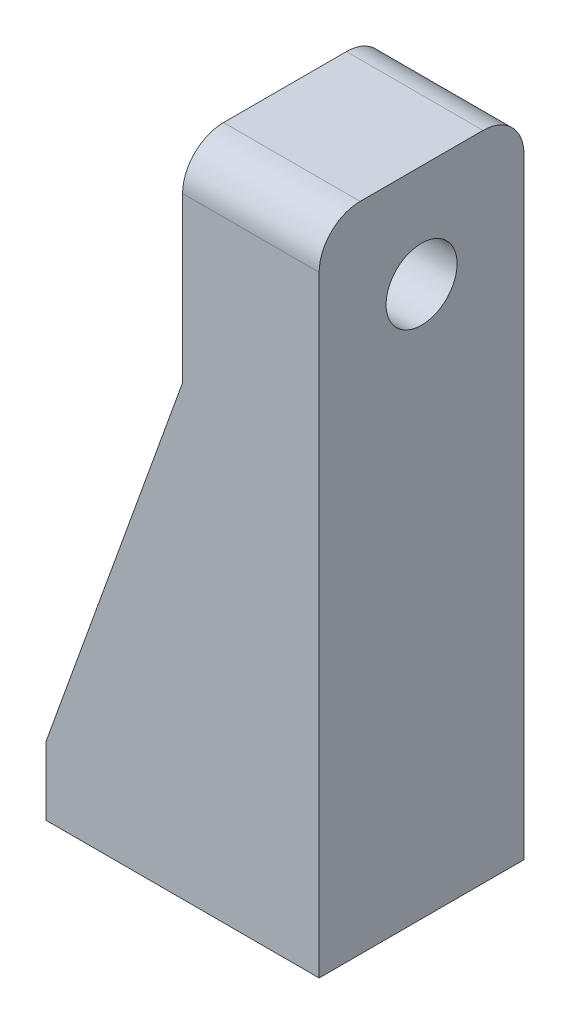
ISO-10303-21;
HEADER;
FILE_DESCRIPTION(('STEP AP214'),'2;1');
FILE_NAME('part.step','',(''),(''),'','','');
FILE_SCHEMA(('AUTOMOTIVE_DESIGN { 1 0 10303 214 1 1 1 1 }'));
ENDSEC;
DATA;
#1=APPLICATION_CONTEXT('core data for automotive mechanical design processes');
#2=APPLICATION_PROTOCOL_DEFINITION('international standard','automotive_design',2000,#1);
#3=PRODUCT_CONTEXT('',#1,'mechanical');
#4=PRODUCT('Part','Part','',(#3));
#5=PRODUCT_RELATED_PRODUCT_CATEGORY('part','',(#4));
#6=PRODUCT_DEFINITION_FORMATION('','',#4);
#7=PRODUCT_DEFINITION_CONTEXT('part definition',#1,'design');
#8=PRODUCT_DEFINITION('design','',#6,#7);
#9=PRODUCT_DEFINITION_SHAPE('','',#8);
#10=(LENGTH_UNIT() NAMED_UNIT(*) SI_UNIT(.MILLI.,.METRE.));
#11=(NAMED_UNIT(*) PLANE_ANGLE_UNIT() SI_UNIT($,.RADIAN.));
#12=(NAMED_UNIT(*) SI_UNIT($,.STERADIAN.) SOLID_ANGLE_UNIT());
#13=UNCERTAINTY_MEASURE_WITH_UNIT(LENGTH_MEASURE(1.E-05),#10,'distance_accuracy_value','');
#14=(GEOMETRIC_REPRESENTATION_CONTEXT(3) GLOBAL_UNCERTAINTY_ASSIGNED_CONTEXT((#13)) GLOBAL_UNIT_ASSIGNED_CONTEXT((#10,
#11,#12)) REPRESENTATION_CONTEXT('',''));
#15=CARTESIAN_POINT('',(0.,0.,0.));
#16=DIRECTION('',(0.,0.,1.));
#17=DIRECTION('',(1.,0.,0.));
#18=AXIS2_PLACEMENT_3D('',#15,#16,#17);
#19=CARTESIAN_POINT('',(-17.7013145607356,6.37885209395877,15.));
#20=DIRECTION('',(0.940779319520141,-0.339019574601853,0.));
#21=DIRECTION('',(0.339019574601853,0.940779319520141,0.));
#22=AXIS2_PLACEMENT_3D('',#19,#20,#21);
#23=PLANE('',#22);
#24=DIRECTION('',(-0.339019574601853,-0.940779319520141,0.));
#25=VECTOR('',#24,1.);
#26=CARTESIAN_POINT('',(-17.7013145607356,6.37885209395877,0.));
#27=LINE('',#26,#25);
#28=CARTESIAN_POINT('',(-10.,27.75,0.));
#29=VERTEX_POINT('',#28);
#30=CARTESIAN_POINT('',(-20.,0.,0.));
#31=VERTEX_POINT('',#30);
#32=EDGE_CURVE('E132',#29,#31,#27,.T.);
#33=ORIENTED_EDGE('',*,*,#32,.T.);
#34=DIRECTION('',(0.,0.,-1.));
#35=VECTOR('',#34,1.);
#36=CARTESIAN_POINT('',(-20.,0.,15.));
#37=LINE('',#36,#35);
#38=CARTESIAN_POINT('',(-20.,0.,15.));
#39=VERTEX_POINT('',#38);
#40=EDGE_CURVE('E111',#39,#31,#37,.T.);
#41=ORIENTED_EDGE('',*,*,#40,.F.);
#42=DIRECTION('',(-0.339019574601853,-0.940779319520141,0.));
#43=VECTOR('',#42,1.);
#44=CARTESIAN_POINT('',(-17.7013145607356,6.37885209395877,15.));
#45=LINE('',#44,#43);
#46=CARTESIAN_POINT('',(-10.,27.75,15.));
#47=VERTEX_POINT('',#46);
#48=EDGE_CURVE('E118',#47,#39,#45,.T.);
#49=ORIENTED_EDGE('',*,*,#48,.F.);
#50=DIRECTION('',(0.,0.,-1.));
#51=VECTOR('',#50,1.);
#52=CARTESIAN_POINT('',(-10.,27.75,15.));
#53=LINE('',#52,#51);
#54=EDGE_CURVE('E171',#47,#29,#53,.T.);
#55=ORIENTED_EDGE('',*,*,#54,.T.);
#56=EDGE_LOOP('',(#33,#41,#49,#55));
#57=FACE_BOUND('',#56,.T.);
#58=ADVANCED_FACE('F40',(#57),#23,.F.);
#59=CARTESIAN_POINT('',(-20.,0.,15.));
#60=DIRECTION('',(1.,0.,0.));
#61=DIRECTION('',(0.,0.,-1.));
#62=AXIS2_PLACEMENT_3D('',#59,#60,#61);
#63=PLANE('',#62);
#64=DIRECTION('',(0.,-1.,0.));
#65=VECTOR('',#64,1.);
#66=CARTESIAN_POINT('',(-20.,0.,0.));
#67=LINE('',#66,#65);
#68=CARTESIAN_POINT('',(-20.,-5.,0.));
#69=VERTEX_POINT('',#68);
#70=EDGE_CURVE('E182',#31,#69,#67,.T.);
#71=ORIENTED_EDGE('',*,*,#70,.T.);
#72=DIRECTION('',(0.,0.,-1.));
#73=VECTOR('',#72,1.);
#74=CARTESIAN_POINT('',(-20.,-5.,15.));
#75=LINE('',#74,#73);
#76=CARTESIAN_POINT('',(-20.,-5.,15.));
#77=VERTEX_POINT('',#76);
#78=EDGE_CURVE('E114',#77,#69,#75,.T.);
#79=ORIENTED_EDGE('',*,*,#78,.F.);
#80=DIRECTION('',(0.,-1.,0.));
#81=VECTOR('',#80,1.);
#82=CARTESIAN_POINT('',(-20.,0.,15.));
#83=LINE('',#82,#81);
#84=EDGE_CURVE('E107',#39,#77,#83,.T.);
#85=ORIENTED_EDGE('',*,*,#84,.F.);
#86=ORIENTED_EDGE('',*,*,#40,.T.);
#87=EDGE_LOOP('',(#71,#79,#85,#86));
#88=FACE_BOUND('',#87,.T.);
#89=ADVANCED_FACE('F109',(#88),#63,.F.);
#90=CARTESIAN_POINT('',(0.,-5.,15.));
#91=DIRECTION('',(0.,1.,0.));
#92=DIRECTION('',(0.,0.,1.));
#93=AXIS2_PLACEMENT_3D('',#90,#91,#92);
#94=PLANE('',#93);
#95=DIRECTION('',(1.,0.,0.));
#96=VECTOR('',#95,1.);
#97=CARTESIAN_POINT('',(0.,-5.,0.));
#98=LINE('',#97,#96);
#99=CARTESIAN_POINT('',(0.,-5.,0.));
#100=VERTEX_POINT('',#99);
#101=EDGE_CURVE('E180',#69,#100,#98,.T.);
#102=ORIENTED_EDGE('',*,*,#101,.T.);
#103=DIRECTION('',(0.,0.,-1.));
#104=VECTOR('',#103,1.);
#105=CARTESIAN_POINT('',(0.,-5.,15.));
#106=LINE('',#105,#104);
#107=CARTESIAN_POINT('',(0.,-5.,15.));
#108=VERTEX_POINT('',#107);
#109=EDGE_CURVE('E137',#108,#100,#106,.T.);
#110=ORIENTED_EDGE('',*,*,#109,.F.);
#111=DIRECTION('',(1.,0.,0.));
#112=VECTOR('',#111,1.);
#113=CARTESIAN_POINT('',(0.,-5.,15.));
#114=LINE('',#113,#112);
#115=EDGE_CURVE('E117',#77,#108,#114,.T.);
#116=ORIENTED_EDGE('',*,*,#115,.F.);
#117=ORIENTED_EDGE('',*,*,#78,.T.);
#118=EDGE_LOOP('',(#102,#110,#116,#117));
#119=FACE_BOUND('',#118,.T.);
#120=ADVANCED_FACE('F235',(#119),#94,.F.);
#121=CARTESIAN_POINT('',(0.,0.,15.));
#122=DIRECTION('',(-1.,0.,0.));
#123=DIRECTION('',(0.,0.,1.));
#124=AXIS2_PLACEMENT_3D('',#121,#122,#123);
#125=PLANE('',#124);
#126=CARTESIAN_POINT('',(0.,35.25,7.5));
#127=DIRECTION('',(1.,0.,0.));
#128=DIRECTION('',(0.,0.,-1.));
#129=AXIS2_PLACEMENT_3D('',#126,#127,#128);
#130=CIRCLE('',#129,2.6);
#131=CARTESIAN_POINT('',(0.,35.25,4.9));
#132=VERTEX_POINT('',#131);
#133=EDGE_CURVE('E187',#132,#132,#130,.T.);
#134=ORIENTED_EDGE('',*,*,#133,.F.);
#135=EDGE_LOOP('',(#134));
#136=FACE_BOUND('',#135,.T.);
#137=DIRECTION('',(0.,0.,-1.));
#138=VECTOR('',#137,1.);
#139=CARTESIAN_POINT('',(0.,42.75,15.));
#140=LINE('',#139,#138);
#141=CARTESIAN_POINT('',(0.,42.75,12.));
#142=VERTEX_POINT('',#141);
#143=CARTESIAN_POINT('',(0.,42.75,3.));
#144=VERTEX_POINT('',#143);
#145=EDGE_CURVE('E156',#142,#144,#140,.T.);
#146=ORIENTED_EDGE('',*,*,#145,.F.);
#147=CARTESIAN_POINT('',(0.,39.75,12.));
#148=DIRECTION('',(-1.,0.,0.));
#149=DIRECTION('',(0.,0.,1.));
#150=AXIS2_PLACEMENT_3D('',#147,#148,#149);
#151=CIRCLE('',#150,3.);
#152=CARTESIAN_POINT('',(0.,39.75,15.));
#153=VERTEX_POINT('',#152);
#154=EDGE_CURVE('E150',#142,#153,#151,.F.);
#155=ORIENTED_EDGE('',*,*,#154,.T.);
#156=DIRECTION('',(0.,1.,0.));
#157=VECTOR('',#156,1.);
#158=CARTESIAN_POINT('',(0.,0.,15.));
#159=LINE('',#158,#157);
#160=EDGE_CURVE('E155',#108,#153,#159,.T.);
#161=ORIENTED_EDGE('',*,*,#160,.F.);
#162=ORIENTED_EDGE('',*,*,#109,.T.);
#163=DIRECTION('',(0.,1.,0.));
#164=VECTOR('',#163,1.);
#165=CARTESIAN_POINT('',(0.,0.,0.));
#166=LINE('',#165,#164);
#167=CARTESIAN_POINT('',(0.,39.75,0.));
#168=VERTEX_POINT('',#167);
#169=EDGE_CURVE('E176',#100,#168,#166,.T.);
#170=ORIENTED_EDGE('',*,*,#169,.T.);
#171=CARTESIAN_POINT('',(0.,39.75,3.));
#172=DIRECTION('',(-1.,0.,0.));
#173=DIRECTION('',(0.,0.,1.));
#174=AXIS2_PLACEMENT_3D('',#171,#172,#173);
#175=CIRCLE('',#174,3.);
#176=EDGE_CURVE('E61',#168,#144,#175,.F.);
#177=ORIENTED_EDGE('',*,*,#176,.T.);
#178=EDGE_LOOP('',(#146,#155,#161,#162,#170,#177));
#179=FACE_BOUND('',#178,.T.);
#180=ADVANCED_FACE('F153',(#136,#179),#125,.F.);
#181=CARTESIAN_POINT('',(0.,42.75,15.));
#182=DIRECTION('',(0.,-1.,0.));
#183=DIRECTION('',(0.,0.,-1.));
#184=AXIS2_PLACEMENT_3D('',#181,#182,#183);
#185=PLANE('',#184);
#186=DIRECTION('',(0.,0.,-1.));
#187=VECTOR('',#186,1.);
#188=CARTESIAN_POINT('',(-10.,42.75,15.));
#189=LINE('',#188,#187);
#190=CARTESIAN_POINT('',(-10.,42.75,12.));
#191=VERTEX_POINT('',#190);
#192=CARTESIAN_POINT('',(-10.,42.75,3.));
#193=VERTEX_POINT('',#192);
#194=EDGE_CURVE('E167',#191,#193,#189,.T.);
#195=ORIENTED_EDGE('',*,*,#194,.F.);
#196=DIRECTION('',(-1.,0.,0.));
#197=VECTOR('',#196,1.);
#198=CARTESIAN_POINT('',(0.,42.75,12.));
#199=LINE('',#198,#197);
#200=EDGE_CURVE('E147',#191,#142,#199,.F.);
#201=ORIENTED_EDGE('',*,*,#200,.T.);
#202=ORIENTED_EDGE('',*,*,#145,.T.);
#203=DIRECTION('',(-1.,0.,0.));
#204=VECTOR('',#203,1.);
#205=CARTESIAN_POINT('',(0.,42.75,3.));
#206=LINE('',#205,#204);
#207=EDGE_CURVE('E144',#144,#193,#206,.T.);
#208=ORIENTED_EDGE('',*,*,#207,.T.);
#209=EDGE_LOOP('',(#195,#201,#202,#208));
#210=FACE_BOUND('',#209,.T.);
#211=ADVANCED_FACE('F169',(#210),#185,.F.);
#212=CARTESIAN_POINT('',(-9.99999999999999,0.,15.));
#213=DIRECTION('',(1.,0.,0.));
#214=DIRECTION('',(0.,1.,0.));
#215=AXIS2_PLACEMENT_3D('',#212,#213,#214);
#216=PLANE('',#215);
#217=CARTESIAN_POINT('',(-10.,35.25,7.5));
#218=DIRECTION('',(-1.,0.,0.));
#219=DIRECTION('',(0.,-1.,0.));
#220=AXIS2_PLACEMENT_3D('',#217,#218,#219);
#221=CIRCLE('',#220,4.5);
#222=CARTESIAN_POINT('',(-10.,30.75,7.5));
#223=VERTEX_POINT('',#222);
#224=EDGE_CURVE('E193',#223,#223,#221,.T.);
#225=ORIENTED_EDGE('',*,*,#224,.F.);
#226=EDGE_LOOP('',(#225));
#227=FACE_BOUND('',#226,.T.);
#228=DIRECTION('',(0.,-1.,0.));
#229=VECTOR('',#228,1.);
#230=CARTESIAN_POINT('',(-9.99999999999999,0.,15.));
#231=LINE('',#230,#229);
#232=CARTESIAN_POINT('',(-10.,39.75,15.));
#233=VERTEX_POINT('',#232);
#234=EDGE_CURVE('E125',#233,#47,#231,.T.);
#235=ORIENTED_EDGE('',*,*,#234,.F.);
#236=CARTESIAN_POINT('',(-10.,39.75,12.));
#237=DIRECTION('',(1.,0.,0.));
#238=DIRECTION('',(0.,1.,0.));
#239=AXIS2_PLACEMENT_3D('',#236,#237,#238);
#240=CIRCLE('',#239,3.);
#241=EDGE_CURVE('E142',#233,#191,#240,.F.);
#242=ORIENTED_EDGE('',*,*,#241,.T.);
#243=ORIENTED_EDGE('',*,*,#194,.T.);
#244=CARTESIAN_POINT('',(-10.,39.75,3.));
#245=DIRECTION('',(1.,0.,0.));
#246=DIRECTION('',(0.,1.,0.));
#247=AXIS2_PLACEMENT_3D('',#244,#245,#246);
#248=CIRCLE('',#247,3.);
#249=CARTESIAN_POINT('',(-10.,39.75,0.));
#250=VERTEX_POINT('',#249);
#251=EDGE_CURVE('E135',#193,#250,#248,.F.);
#252=ORIENTED_EDGE('',*,*,#251,.T.);
#253=DIRECTION('',(0.,-1.,0.));
#254=VECTOR('',#253,1.);
#255=CARTESIAN_POINT('',(-9.99999999999999,0.,0.));
#256=LINE('',#255,#254);
#257=EDGE_CURVE('E129',#250,#29,#256,.T.);
#258=ORIENTED_EDGE('',*,*,#257,.T.);
#259=ORIENTED_EDGE('',*,*,#54,.F.);
#260=EDGE_LOOP('',(#235,#242,#243,#252,#258,#259));
#261=FACE_BOUND('',#260,.T.);
#262=ADVANCED_FACE('F166',(#227,#261),#216,.F.);
#263=CARTESIAN_POINT('',(0.,0.,15.));
#264=DIRECTION('',(0.,0.,1.));
#265=DIRECTION('',(1.,0.,0.));
#266=AXIS2_PLACEMENT_3D('',#263,#264,#265);
#267=PLANE('',#266);
#268=ORIENTED_EDGE('',*,*,#160,.T.);
#269=DIRECTION('',(-1.,0.,0.));
#270=VECTOR('',#269,1.);
#271=CARTESIAN_POINT('',(-10.,39.75,15.));
#272=LINE('',#271,#270);
#273=EDGE_CURVE('E133',#153,#233,#272,.T.);
#274=ORIENTED_EDGE('',*,*,#273,.T.);
#275=ORIENTED_EDGE('',*,*,#234,.T.);
#276=ORIENTED_EDGE('',*,*,#48,.T.);
#277=ORIENTED_EDGE('',*,*,#84,.T.);
#278=ORIENTED_EDGE('',*,*,#115,.T.);
#279=EDGE_LOOP('',(#268,#274,#275,#276,#277,#278));
#280=FACE_BOUND('',#279,.T.);
#281=ADVANCED_FACE('F122',(#280),#267,.T.);
#282=CARTESIAN_POINT('',(0.,0.,0.));
#283=DIRECTION('',(0.,0.,1.));
#284=DIRECTION('',(1.,0.,0.));
#285=AXIS2_PLACEMENT_3D('',#282,#283,#284);
#286=PLANE('',#285);
#287=ORIENTED_EDGE('',*,*,#257,.F.);
#288=DIRECTION('',(-1.,0.,0.));
#289=VECTOR('',#288,1.);
#290=CARTESIAN_POINT('',(0.,39.75,0.));
#291=LINE('',#290,#289);
#292=EDGE_CURVE('E48',#250,#168,#291,.F.);
#293=ORIENTED_EDGE('',*,*,#292,.T.);
#294=ORIENTED_EDGE('',*,*,#169,.F.);
#295=ORIENTED_EDGE('',*,*,#101,.F.);
#296=ORIENTED_EDGE('',*,*,#70,.F.);
#297=ORIENTED_EDGE('',*,*,#32,.F.);
#298=EDGE_LOOP('',(#287,#293,#294,#295,#296,#297));
#299=FACE_BOUND('',#298,.T.);
#300=ADVANCED_FACE('F179',(#299),#286,.F.);
#301=CARTESIAN_POINT('',(0.,39.75,12.));
#302=DIRECTION('',(1.,0.,0.));
#303=DIRECTION('',(0.,0.,-1.));
#304=AXIS2_PLACEMENT_3D('',#301,#302,#303);
#305=CYLINDRICAL_SURFACE('',#304,3.);
#306=ORIENTED_EDGE('',*,*,#154,.F.);
#307=ORIENTED_EDGE('',*,*,#200,.F.);
#308=ORIENTED_EDGE('',*,*,#241,.F.);
#309=ORIENTED_EDGE('',*,*,#273,.F.);
#310=EDGE_LOOP('',(#306,#307,#308,#309));
#311=FACE_BOUND('',#310,.T.);
#312=ADVANCED_FACE('F162',(#311),#305,.T.);
#313=CARTESIAN_POINT('',(0.,39.75,3.));
#314=DIRECTION('',(-1.,0.,0.));
#315=DIRECTION('',(0.,0.,1.));
#316=AXIS2_PLACEMENT_3D('',#313,#314,#315);
#317=CYLINDRICAL_SURFACE('',#316,3.);
#318=ORIENTED_EDGE('',*,*,#176,.F.);
#319=ORIENTED_EDGE('',*,*,#292,.F.);
#320=ORIENTED_EDGE('',*,*,#251,.F.);
#321=ORIENTED_EDGE('',*,*,#207,.F.);
#322=EDGE_LOOP('',(#318,#319,#320,#321));
#323=FACE_BOUND('',#322,.T.);
#324=ADVANCED_FACE('F240',(#323),#317,.T.);
#325=CARTESIAN_POINT('',(-20.,35.25,7.5));
#326=DIRECTION('',(1.,0.,0.));
#327=DIRECTION('',(0.,0.,-1.));
#328=AXIS2_PLACEMENT_3D('',#325,#326,#327);
#329=CYLINDRICAL_SURFACE('',#328,2.6);
#330=CARTESIAN_POINT('',(-9.00501256289338,35.25,7.5));
#331=DIRECTION('',(-1.,0.,0.));
#332=DIRECTION('',(0.,-1.,0.));
#333=AXIS2_PLACEMENT_3D('',#330,#331,#332);
#334=CIRCLE('',#333,2.6);
#335=CARTESIAN_POINT('',(-9.00501256289338,32.65,7.5));
#336=VERTEX_POINT('',#335);
#337=EDGE_CURVE('E11',#336,#336,#334,.T.);
#338=ORIENTED_EDGE('',*,*,#337,.T.);
#339=EDGE_LOOP('',(#338));
#340=FACE_BOUND('',#339,.T.);
#341=ORIENTED_EDGE('',*,*,#133,.T.);
#342=EDGE_LOOP('',(#341));
#343=FACE_BOUND('',#342,.T.);
#344=ADVANCED_FACE('F217',(#340,#343),#329,.F.);
#345=CARTESIAN_POINT('',(-8.,35.25,7.5));
#346=DIRECTION('',(-1.,0.,0.));
#347=DIRECTION('',(0.,-1.,0.));
#348=AXIS2_PLACEMENT_3D('',#345,#346,#347);
#349=CYLINDRICAL_SURFACE('',#348,4.5);
#350=CARTESIAN_POINT('',(-8.,35.25,7.5));
#351=DIRECTION('',(-1.,0.,0.));
#352=DIRECTION('',(0.,-1.,0.));
#353=AXIS2_PLACEMENT_3D('',#350,#351,#352);
#354=CIRCLE('',#353,4.5);
#355=CARTESIAN_POINT('',(-8.,30.75,7.5));
#356=VERTEX_POINT('',#355);
#357=EDGE_CURVE('E192',#356,#356,#354,.T.);
#358=ORIENTED_EDGE('',*,*,#357,.F.);
#359=EDGE_LOOP('',(#358));
#360=FACE_BOUND('',#359,.T.);
#361=ORIENTED_EDGE('',*,*,#224,.T.);
#362=EDGE_LOOP('',(#361));
#363=FACE_BOUND('',#362,.T.);
#364=ADVANCED_FACE('F211',(#360,#363),#349,.F.);
#365=CARTESIAN_POINT('',(-8.,35.25,7.5));
#366=DIRECTION('',(-1.,0.,0.));
#367=DIRECTION('',(0.,-1.,0.));
#368=AXIS2_PLACEMENT_3D('',#365,#366,#367);
#369=PLANE('',#368);
#370=CARTESIAN_POINT('',(-8.,35.25,7.5));
#371=DIRECTION('',(-1.,0.,0.));
#372=DIRECTION('',(0.,-1.,0.));
#373=AXIS2_PLACEMENT_3D('',#370,#371,#372);
#374=CIRCLE('',#373,3.5);
#375=CARTESIAN_POINT('',(-8.,31.75,7.5));
#376=VERTEX_POINT('',#375);
#377=EDGE_CURVE('E196',#376,#376,#374,.T.);
#378=ORIENTED_EDGE('',*,*,#377,.F.);
#379=EDGE_LOOP('',(#378));
#380=FACE_BOUND('',#379,.T.);
#381=ORIENTED_EDGE('',*,*,#357,.T.);
#382=EDGE_LOOP('',(#381));
#383=FACE_BOUND('',#382,.T.);
#384=ADVANCED_FACE('F208',(#380,#383),#369,.T.);
#385=CARTESIAN_POINT('',(-8.,35.25,7.5));
#386=DIRECTION('',(-1.,0.,0.));
#387=DIRECTION('',(0.,-1.,0.));
#388=AXIS2_PLACEMENT_3D('',#385,#386,#387);
#389=CYLINDRICAL_SURFACE('',#388,3.5);
#390=ORIENTED_EDGE('',*,*,#377,.T.);
#391=EDGE_LOOP('',(#390));
#392=FACE_BOUND('',#391,.T.);
#393=CARTESIAN_POINT('',(-10.,35.25,7.5));
#394=DIRECTION('',(-1.,0.,0.));
#395=DIRECTION('',(0.,-1.,0.));
#396=AXIS2_PLACEMENT_3D('',#393,#394,#395);
#397=CIRCLE('',#396,3.5);
#398=CARTESIAN_POINT('',(-10.,31.75,7.5));
#399=VERTEX_POINT('',#398);
#400=EDGE_CURVE('E199',#399,#399,#397,.T.);
#401=ORIENTED_EDGE('',*,*,#400,.F.);
#402=EDGE_LOOP('',(#401));
#403=FACE_BOUND('',#402,.T.);
#404=ADVANCED_FACE('F205',(#392,#403),#389,.T.);
#405=CARTESIAN_POINT('',(-9.00501256289338,35.25,7.5));
#406=DIRECTION('',(-1.,0.,0.));
#407=DIRECTION('',(0.,-1.,0.));
#408=AXIS2_PLACEMENT_3D('',#405,#406,#407);
#409=TOROIDAL_SURFACE('',#408,3.6,1.);
#410=ORIENTED_EDGE('',*,*,#337,.F.);
#411=EDGE_LOOP('',(#410));
#412=FACE_BOUND('',#411,.T.);
#413=ORIENTED_EDGE('',*,*,#400,.T.);
#414=EDGE_LOOP('',(#413));
#415=FACE_BOUND('',#414,.T.);
#416=ADVANCED_FACE('F42',(#412,#415),#409,.T.);
#417=CLOSED_SHELL('',(#58,#89,#120,#180,#211,#262,#281,#300,#312,#324,#344,#364,#384,#404,#416));
#418=MANIFOLD_SOLID_BREP('B2',#417);
#419=ADVANCED_BREP_SHAPE_REPRESENTATION('',(#18,#418),#14);
#420=SHAPE_DEFINITION_REPRESENTATION(#9,#419);
ENDSEC;
END-ISO-10303-21;
